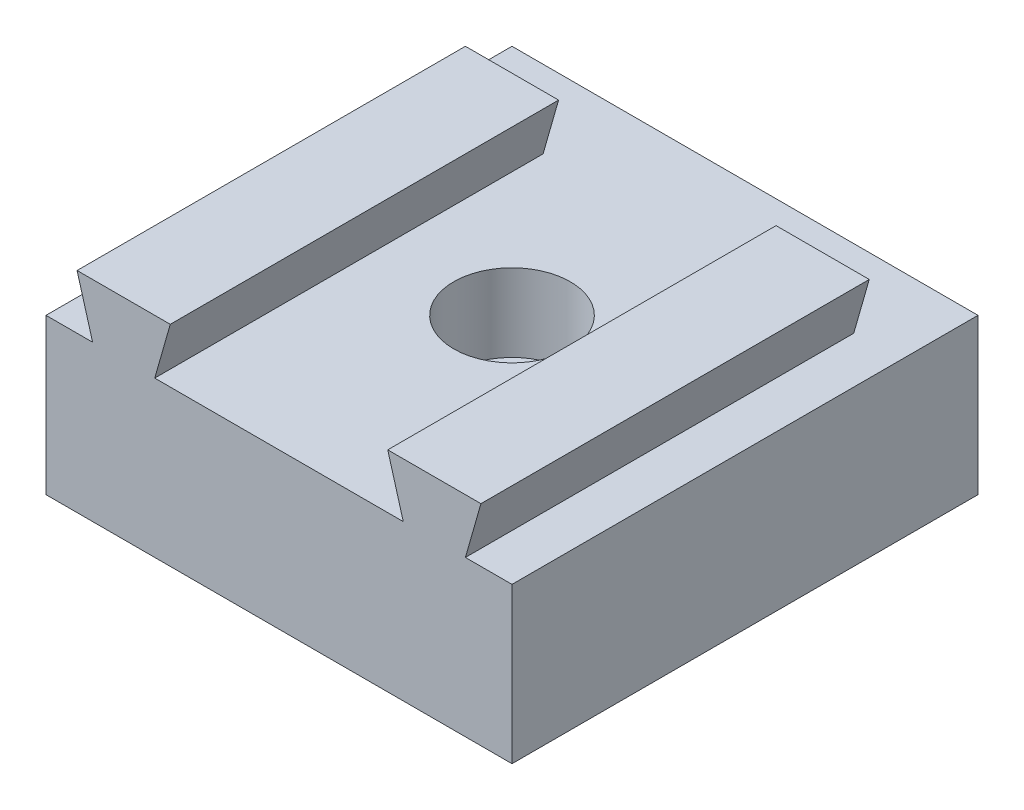
ISO-10303-21;
HEADER;
FILE_DESCRIPTION(('STEP AP214'),'2;1');
FILE_NAME('part.step','',(''),(''),'','','');
FILE_SCHEMA(('AUTOMOTIVE_DESIGN { 1 0 10303 214 1 1 1 1 }'));
ENDSEC;
DATA;
#1=APPLICATION_CONTEXT('core data for automotive mechanical design processes');
#2=APPLICATION_PROTOCOL_DEFINITION('international standard','automotive_design',2000,#1);
#3=PRODUCT_CONTEXT('',#1,'mechanical');
#4=PRODUCT('Part','Part','',(#3));
#5=PRODUCT_RELATED_PRODUCT_CATEGORY('part','',(#4));
#6=PRODUCT_DEFINITION_FORMATION('','',#4);
#7=PRODUCT_DEFINITION_CONTEXT('part definition',#1,'design');
#8=PRODUCT_DEFINITION('design','',#6,#7);
#9=PRODUCT_DEFINITION_SHAPE('','',#8);
#10=(LENGTH_UNIT() NAMED_UNIT(*) SI_UNIT(.MILLI.,.METRE.));
#11=(NAMED_UNIT(*) PLANE_ANGLE_UNIT() SI_UNIT($,.RADIAN.));
#12=(NAMED_UNIT(*) SI_UNIT($,.STERADIAN.) SOLID_ANGLE_UNIT());
#13=UNCERTAINTY_MEASURE_WITH_UNIT(LENGTH_MEASURE(1.E-05),#10,'distance_accuracy_value','');
#14=(GEOMETRIC_REPRESENTATION_CONTEXT(3) GLOBAL_UNCERTAINTY_ASSIGNED_CONTEXT((#13)) GLOBAL_UNIT_ASSIGNED_CONTEXT((#10,
#11,#12)) REPRESENTATION_CONTEXT('',''));
#15=CARTESIAN_POINT('',(0.,0.,0.));
#16=DIRECTION('',(0.,0.,1.));
#17=DIRECTION('',(1.,0.,0.));
#18=AXIS2_PLACEMENT_3D('',#15,#16,#17);
#19=CARTESIAN_POINT('',(0.,0.,0.));
#20=DIRECTION('',(0.,1.,0.));
#21=DIRECTION('',(0.,0.,1.));
#22=AXIS2_PLACEMENT_3D('',#19,#20,#21);
#23=CYLINDRICAL_SURFACE('',#22,4.);
#24=CARTESIAN_POINT('',(0.,10.,0.));
#25=DIRECTION('',(0.,1.,0.));
#26=DIRECTION('',(0.,0.,1.));
#27=AXIS2_PLACEMENT_3D('',#24,#25,#26);
#28=CIRCLE('',#27,4.);
#29=CARTESIAN_POINT('',(0.,10.,4.));
#30=VERTEX_POINT('',#29);
#31=EDGE_CURVE('E442',#30,#30,#28,.T.);
#32=ORIENTED_EDGE('',*,*,#31,.T.);
#33=EDGE_LOOP('',(#32));
#34=FACE_BOUND('',#33,.T.);
#35=CARTESIAN_POINT('',(0.,3.,0.));
#36=DIRECTION('',(0.,-1.,0.));
#37=DIRECTION('',(0.,0.,-1.));
#38=AXIS2_PLACEMENT_3D('',#35,#36,#37);
#39=CIRCLE('',#38,4.);
#40=CARTESIAN_POINT('',(0.,3.,-4.));
#41=VERTEX_POINT('',#40);
#42=EDGE_CURVE('E39',#41,#41,#39,.F.);
#43=ORIENTED_EDGE('',*,*,#42,.F.);
#44=EDGE_LOOP('',(#43));
#45=FACE_BOUND('',#44,.T.);
#46=ADVANCED_FACE('F35',(#34,#45),#23,.F.);
#47=CARTESIAN_POINT('',(0.,20.,0.));
#48=DIRECTION('',(0.,-1.,0.));
#49=DIRECTION('',(0.,0.,-1.));
#50=AXIS2_PLACEMENT_3D('',#47,#48,#49);
#51=PLANE('',#50);
#52=CARTESIAN_POINT('',(0.,20.,0.));
#53=DIRECTION('',(0.,1.,0.));
#54=DIRECTION('',(0.,0.,1.));
#55=AXIS2_PLACEMENT_3D('',#52,#53,#54);
#56=CIRCLE('',#55,7.5);
#57=CARTESIAN_POINT('',(0.,20.,7.5));
#58=VERTEX_POINT('',#57);
#59=EDGE_CURVE('E439',#58,#58,#56,.T.);
#60=ORIENTED_EDGE('',*,*,#59,.F.);
#61=EDGE_LOOP('',(#60));
#62=FACE_BOUND('',#61,.T.);
#63=DIRECTION('',(1.,0.,0.));
#64=VECTOR('',#63,1.);
#65=CARTESIAN_POINT('',(30.,20.,30.));
#66=LINE('',#65,#64);
#67=CARTESIAN_POINT('',(-16.,20.,30.));
#68=VERTEX_POINT('',#67);
#69=CARTESIAN_POINT('',(16.,20.,30.));
#70=VERTEX_POINT('',#69);
#71=EDGE_CURVE('E201',#68,#70,#66,.T.);
#72=ORIENTED_EDGE('',*,*,#71,.T.);
#73=DIRECTION('',(0.,0.,1.));
#74=VECTOR('',#73,1.);
#75=CARTESIAN_POINT('',(16.,20.,-20.));
#76=LINE('',#75,#74);
#77=CARTESIAN_POINT('',(16.,20.,-20.));
#78=VERTEX_POINT('',#77);
#79=EDGE_CURVE('E52',#78,#70,#76,.T.);
#80=ORIENTED_EDGE('',*,*,#79,.F.);
#81=DIRECTION('',(1.,0.,0.));
#82=VECTOR('',#81,1.);
#83=CARTESIAN_POINT('',(16.,20.,-20.));
#84=LINE('',#83,#82);
#85=CARTESIAN_POINT('',(24.,20.,-20.));
#86=VERTEX_POINT('',#85);
#87=EDGE_CURVE('E56',#78,#86,#84,.T.);
#88=ORIENTED_EDGE('',*,*,#87,.T.);
#89=DIRECTION('',(0.,0.,1.));
#90=VECTOR('',#89,1.);
#91=CARTESIAN_POINT('',(24.,20.,-20.));
#92=LINE('',#91,#90);
#93=CARTESIAN_POINT('',(24.,20.,30.));
#94=VERTEX_POINT('',#93);
#95=EDGE_CURVE('E144',#86,#94,#92,.T.);
#96=ORIENTED_EDGE('',*,*,#95,.T.);
#97=CARTESIAN_POINT('',(30.,20.,30.));
#98=VERTEX_POINT('',#97);
#99=EDGE_CURVE('E200',#94,#98,#66,.T.);
#100=ORIENTED_EDGE('',*,*,#99,.T.);
#101=DIRECTION('',(0.,0.,-1.));
#102=VECTOR('',#101,1.);
#103=CARTESIAN_POINT('',(30.,20.,30.));
#104=LINE('',#103,#102);
#105=CARTESIAN_POINT('',(30.,20.,-30.));
#106=VERTEX_POINT('',#105);
#107=EDGE_CURVE('E225',#98,#106,#104,.T.);
#108=ORIENTED_EDGE('',*,*,#107,.T.);
#109=DIRECTION('',(-1.,0.,0.));
#110=VECTOR('',#109,1.);
#111=CARTESIAN_POINT('',(30.,20.,-30.));
#112=LINE('',#111,#110);
#113=CARTESIAN_POINT('',(-30.,20.,-30.));
#114=VERTEX_POINT('',#113);
#115=EDGE_CURVE('E431',#106,#114,#112,.T.);
#116=ORIENTED_EDGE('',*,*,#115,.T.);
#117=DIRECTION('',(0.,0.,1.));
#118=VECTOR('',#117,1.);
#119=CARTESIAN_POINT('',(-30.,20.,30.));
#120=LINE('',#119,#118);
#121=CARTESIAN_POINT('',(-30.,20.,30.));
#122=VERTEX_POINT('',#121);
#123=EDGE_CURVE('E220',#114,#122,#120,.T.);
#124=ORIENTED_EDGE('',*,*,#123,.T.);
#125=CARTESIAN_POINT('',(-24.,20.,30.));
#126=VERTEX_POINT('',#125);
#127=EDGE_CURVE('E204',#122,#126,#66,.T.);
#128=ORIENTED_EDGE('',*,*,#127,.T.);
#129=DIRECTION('',(0.,0.,1.));
#130=VECTOR('',#129,1.);
#131=CARTESIAN_POINT('',(-24.,20.,-20.));
#132=LINE('',#131,#130);
#133=CARTESIAN_POINT('',(-24.,20.,-20.));
#134=VERTEX_POINT('',#133);
#135=EDGE_CURVE('E174',#134,#126,#132,.T.);
#136=ORIENTED_EDGE('',*,*,#135,.F.);
#137=DIRECTION('',(1.,0.,0.));
#138=VECTOR('',#137,1.);
#139=CARTESIAN_POINT('',(-24.,20.,-20.));
#140=LINE('',#139,#138);
#141=CARTESIAN_POINT('',(-16.,20.,-20.));
#142=VERTEX_POINT('',#141);
#143=EDGE_CURVE('E165',#134,#142,#140,.T.);
#144=ORIENTED_EDGE('',*,*,#143,.T.);
#145=DIRECTION('',(0.,0.,1.));
#146=VECTOR('',#145,1.);
#147=CARTESIAN_POINT('',(-16.,20.,-20.));
#148=LINE('',#147,#146);
#149=EDGE_CURVE('E183',#142,#68,#148,.T.);
#150=ORIENTED_EDGE('',*,*,#149,.T.);
#151=EDGE_LOOP('',(#72,#80,#88,#96,#100,#108,#116,#124,#128,#136,#144,#150));
#152=FACE_BOUND('',#151,.T.);
#153=ADVANCED_FACE('F236',(#62,#152),#51,.F.);
#154=CARTESIAN_POINT('',(30.,20.,30.));
#155=DIRECTION('',(0.,0.,-1.));
#156=DIRECTION('',(-1.,0.,0.));
#157=AXIS2_PLACEMENT_3D('',#154,#155,#156);
#158=PLANE('',#157);
#159=DIRECTION('',(1.,0.,0.));
#160=VECTOR('',#159,1.);
#161=CARTESIAN_POINT('',(30.,0.,30.));
#162=LINE('',#161,#160);
#163=CARTESIAN_POINT('',(-30.,0.,30.));
#164=VERTEX_POINT('',#163);
#165=CARTESIAN_POINT('',(30.,0.,30.));
#166=VERTEX_POINT('',#165);
#167=EDGE_CURVE('E180',#164,#166,#162,.T.);
#168=ORIENTED_EDGE('',*,*,#167,.T.);
#169=DIRECTION('',(0.,-1.,0.));
#170=VECTOR('',#169,1.);
#171=CARTESIAN_POINT('',(30.,20.,30.));
#172=LINE('',#171,#170);
#173=EDGE_CURVE('E11',#98,#166,#172,.T.);
#174=ORIENTED_EDGE('',*,*,#173,.F.);
#175=ORIENTED_EDGE('',*,*,#99,.F.);
#176=DIRECTION('',(0.274721127897378,0.961523947640823,0.));
#177=VECTOR('',#176,1.);
#178=CARTESIAN_POINT('',(24.,20.,30.));
#179=LINE('',#178,#177);
#180=CARTESIAN_POINT('',(26.,27.,30.));
#181=VERTEX_POINT('',#180);
#182=EDGE_CURVE('E154',#94,#181,#179,.T.);
#183=ORIENTED_EDGE('',*,*,#182,.T.);
#184=DIRECTION('',(1.,0.,0.));
#185=VECTOR('',#184,1.);
#186=CARTESIAN_POINT('',(14.,27.,30.));
#187=LINE('',#186,#185);
#188=CARTESIAN_POINT('',(14.,27.,30.));
#189=VERTEX_POINT('',#188);
#190=EDGE_CURVE('E139',#189,#181,#187,.T.);
#191=ORIENTED_EDGE('',*,*,#190,.F.);
#192=DIRECTION('',(0.274721127897378,-0.961523947640823,0.));
#193=VECTOR('',#192,1.);
#194=CARTESIAN_POINT('',(14.,27.,30.));
#195=LINE('',#194,#193);
#196=EDGE_CURVE('E151',#189,#70,#195,.T.);
#197=ORIENTED_EDGE('',*,*,#196,.T.);
#198=ORIENTED_EDGE('',*,*,#71,.F.);
#199=DIRECTION('',(0.274721127897378,0.961523947640823,0.));
#200=VECTOR('',#199,1.);
#201=CARTESIAN_POINT('',(-16.,20.,30.));
#202=LINE('',#201,#200);
#203=CARTESIAN_POINT('',(-14.,27.,30.));
#204=VERTEX_POINT('',#203);
#205=EDGE_CURVE('E177',#68,#204,#202,.T.);
#206=ORIENTED_EDGE('',*,*,#205,.T.);
#207=DIRECTION('',(1.,0.,0.));
#208=VECTOR('',#207,1.);
#209=CARTESIAN_POINT('',(-26.,27.,30.));
#210=LINE('',#209,#208);
#211=CARTESIAN_POINT('',(-26.,27.,30.));
#212=VERTEX_POINT('',#211);
#213=EDGE_CURVE('E166',#212,#204,#210,.T.);
#214=ORIENTED_EDGE('',*,*,#213,.F.);
#215=DIRECTION('',(0.274721127897378,-0.961523947640823,0.));
#216=VECTOR('',#215,1.);
#217=CARTESIAN_POINT('',(-26.,27.,30.));
#218=LINE('',#217,#216);
#219=EDGE_CURVE('E158',#212,#126,#218,.T.);
#220=ORIENTED_EDGE('',*,*,#219,.T.);
#221=ORIENTED_EDGE('',*,*,#127,.F.);
#222=DIRECTION('',(0.,-1.,0.));
#223=VECTOR('',#222,1.);
#224=CARTESIAN_POINT('',(-30.,20.,30.));
#225=LINE('',#224,#223);
#226=EDGE_CURVE('E217',#122,#164,#225,.T.);
#227=ORIENTED_EDGE('',*,*,#226,.T.);
#228=EDGE_LOOP('',(#168,#174,#175,#183,#191,#197,#198,#206,#214,#220,#221,#227));
#229=FACE_BOUND('',#228,.T.);
#230=ADVANCED_FACE('F37',(#229),#158,.F.);
#231=CARTESIAN_POINT('',(30.,20.,30.));
#232=DIRECTION('',(-1.,0.,0.));
#233=DIRECTION('',(0.,0.,1.));
#234=AXIS2_PLACEMENT_3D('',#231,#232,#233);
#235=PLANE('',#234);
#236=DIRECTION('',(0.,0.,-1.));
#237=VECTOR('',#236,1.);
#238=CARTESIAN_POINT('',(30.,0.,30.));
#239=LINE('',#238,#237);
#240=CARTESIAN_POINT('',(30.,0.,-30.));
#241=VERTEX_POINT('',#240);
#242=EDGE_CURVE('E213',#166,#241,#239,.T.);
#243=ORIENTED_EDGE('',*,*,#242,.T.);
#244=DIRECTION('',(0.,-1.,0.));
#245=VECTOR('',#244,1.);
#246=CARTESIAN_POINT('',(30.,20.,-30.));
#247=LINE('',#246,#245);
#248=EDGE_CURVE('E44',#106,#241,#247,.T.);
#249=ORIENTED_EDGE('',*,*,#248,.F.);
#250=ORIENTED_EDGE('',*,*,#107,.F.);
#251=ORIENTED_EDGE('',*,*,#173,.T.);
#252=EDGE_LOOP('',(#243,#249,#250,#251));
#253=FACE_BOUND('',#252,.T.);
#254=ADVANCED_FACE('F359',(#253),#235,.F.);
#255=CARTESIAN_POINT('',(30.,20.,-30.));
#256=DIRECTION('',(0.,0.,1.));
#257=DIRECTION('',(1.,0.,0.));
#258=AXIS2_PLACEMENT_3D('',#255,#256,#257);
#259=PLANE('',#258);
#260=DIRECTION('',(-1.,0.,0.));
#261=VECTOR('',#260,1.);
#262=CARTESIAN_POINT('',(30.,0.,-30.));
#263=LINE('',#262,#261);
#264=CARTESIAN_POINT('',(-30.,0.,-30.));
#265=VERTEX_POINT('',#264);
#266=EDGE_CURVE('E206',#241,#265,#263,.T.);
#267=ORIENTED_EDGE('',*,*,#266,.T.);
#268=DIRECTION('',(0.,-1.,0.));
#269=VECTOR('',#268,1.);
#270=CARTESIAN_POINT('',(-30.,20.,-30.));
#271=LINE('',#270,#269);
#272=EDGE_CURVE('E219',#114,#265,#271,.T.);
#273=ORIENTED_EDGE('',*,*,#272,.F.);
#274=ORIENTED_EDGE('',*,*,#115,.F.);
#275=ORIENTED_EDGE('',*,*,#248,.T.);
#276=EDGE_LOOP('',(#267,#273,#274,#275));
#277=FACE_BOUND('',#276,.T.);
#278=ADVANCED_FACE('F388',(#277),#259,.F.);
#279=CARTESIAN_POINT('',(-30.,20.,30.));
#280=DIRECTION('',(1.,0.,0.));
#281=DIRECTION('',(0.,0.,-1.));
#282=AXIS2_PLACEMENT_3D('',#279,#280,#281);
#283=PLANE('',#282);
#284=DIRECTION('',(0.,0.,1.));
#285=VECTOR('',#284,1.);
#286=CARTESIAN_POINT('',(-30.,0.,30.));
#287=LINE('',#286,#285);
#288=EDGE_CURVE('E202',#265,#164,#287,.T.);
#289=ORIENTED_EDGE('',*,*,#288,.T.);
#290=ORIENTED_EDGE('',*,*,#226,.F.);
#291=ORIENTED_EDGE('',*,*,#123,.F.);
#292=ORIENTED_EDGE('',*,*,#272,.T.);
#293=EDGE_LOOP('',(#289,#290,#291,#292));
#294=FACE_BOUND('',#293,.T.);
#295=ADVANCED_FACE('F383',(#294),#283,.F.);
#296=CARTESIAN_POINT('',(0.,0.,0.));
#297=DIRECTION('',(0.,-1.,0.));
#298=DIRECTION('',(0.,0.,-1.));
#299=AXIS2_PLACEMENT_3D('',#296,#297,#298);
#300=PLANE('',#299);
#301=CARTESIAN_POINT('',(0.,0.,0.));
#302=DIRECTION('',(0.,-1.,0.));
#303=DIRECTION('',(0.,0.,-1.));
#304=AXIS2_PLACEMENT_3D('',#301,#302,#303);
#305=CIRCLE('',#304,12.5);
#306=CARTESIAN_POINT('',(0.,0.,-12.5));
#307=VERTEX_POINT('',#306);
#308=EDGE_CURVE('E424',#307,#307,#305,.T.);
#309=ORIENTED_EDGE('',*,*,#308,.F.);
#310=EDGE_LOOP('',(#309));
#311=FACE_BOUND('',#310,.T.);
#312=ORIENTED_EDGE('',*,*,#167,.F.);
#313=ORIENTED_EDGE('',*,*,#288,.F.);
#314=ORIENTED_EDGE('',*,*,#266,.F.);
#315=ORIENTED_EDGE('',*,*,#242,.F.);
#316=EDGE_LOOP('',(#312,#313,#314,#315));
#317=FACE_BOUND('',#316,.T.);
#318=ADVANCED_FACE('F253',(#311,#317),#300,.T.);
#319=CARTESIAN_POINT('',(-26.,27.,-20.));
#320=DIRECTION('',(-0.961523947640823,-0.274721127897378,0.));
#321=DIRECTION('',(0.274721127897378,-0.961523947640823,0.));
#322=AXIS2_PLACEMENT_3D('',#319,#320,#321);
#323=PLANE('',#322);
#324=ORIENTED_EDGE('',*,*,#219,.F.);
#325=DIRECTION('',(0.,0.,1.));
#326=VECTOR('',#325,1.);
#327=CARTESIAN_POINT('',(-26.,27.,-20.));
#328=LINE('',#327,#326);
#329=CARTESIAN_POINT('',(-26.,27.,-20.));
#330=VERTEX_POINT('',#329);
#331=EDGE_CURVE('E178',#330,#212,#328,.T.);
#332=ORIENTED_EDGE('',*,*,#331,.F.);
#333=DIRECTION('',(0.274721127897378,-0.961523947640823,0.));
#334=VECTOR('',#333,1.);
#335=CARTESIAN_POINT('',(-26.,27.,-20.));
#336=LINE('',#335,#334);
#337=EDGE_CURVE('E162',#330,#134,#336,.T.);
#338=ORIENTED_EDGE('',*,*,#337,.T.);
#339=ORIENTED_EDGE('',*,*,#135,.T.);
#340=EDGE_LOOP('',(#324,#332,#338,#339));
#341=FACE_BOUND('',#340,.T.);
#342=ADVANCED_FACE('F242',(#341),#323,.T.);
#343=CARTESIAN_POINT('',(-26.,27.,-20.));
#344=DIRECTION('',(0.,-1.,0.));
#345=DIRECTION('',(0.,0.,-1.));
#346=AXIS2_PLACEMENT_3D('',#343,#344,#345);
#347=PLANE('',#346);
#348=ORIENTED_EDGE('',*,*,#213,.T.);
#349=DIRECTION('',(0.,0.,1.));
#350=VECTOR('',#349,1.);
#351=CARTESIAN_POINT('',(-14.,27.,-20.));
#352=LINE('',#351,#350);
#353=CARTESIAN_POINT('',(-14.,27.,-20.));
#354=VERTEX_POINT('',#353);
#355=EDGE_CURVE('E181',#354,#204,#352,.T.);
#356=ORIENTED_EDGE('',*,*,#355,.F.);
#357=DIRECTION('',(1.,0.,0.));
#358=VECTOR('',#357,1.);
#359=CARTESIAN_POINT('',(-26.,27.,-20.));
#360=LINE('',#359,#358);
#361=EDGE_CURVE('E172',#330,#354,#360,.T.);
#362=ORIENTED_EDGE('',*,*,#361,.F.);
#363=ORIENTED_EDGE('',*,*,#331,.T.);
#364=EDGE_LOOP('',(#348,#356,#362,#363));
#365=FACE_BOUND('',#364,.T.);
#366=ADVANCED_FACE('F245',(#365),#347,.F.);
#367=CARTESIAN_POINT('',(-16.,20.,-20.));
#368=DIRECTION('',(0.961523947640823,-0.274721127897378,0.));
#369=DIRECTION('',(0.274721127897378,0.961523947640823,0.));
#370=AXIS2_PLACEMENT_3D('',#367,#368,#369);
#371=PLANE('',#370);
#372=ORIENTED_EDGE('',*,*,#205,.F.);
#373=ORIENTED_EDGE('',*,*,#149,.F.);
#374=DIRECTION('',(0.274721127897378,0.961523947640823,0.));
#375=VECTOR('',#374,1.);
#376=CARTESIAN_POINT('',(-16.,20.,-20.));
#377=LINE('',#376,#375);
#378=EDGE_CURVE('E169',#142,#354,#377,.T.);
#379=ORIENTED_EDGE('',*,*,#378,.T.);
#380=ORIENTED_EDGE('',*,*,#355,.T.);
#381=EDGE_LOOP('',(#372,#373,#379,#380));
#382=FACE_BOUND('',#381,.T.);
#383=ADVANCED_FACE('F233',(#382),#371,.T.);
#384=CARTESIAN_POINT('',(0.,0.,-20.));
#385=DIRECTION('',(0.,0.,1.));
#386=DIRECTION('',(1.,0.,0.));
#387=AXIS2_PLACEMENT_3D('',#384,#385,#386);
#388=PLANE('',#387);
#389=ORIENTED_EDGE('',*,*,#337,.F.);
#390=ORIENTED_EDGE('',*,*,#361,.T.);
#391=ORIENTED_EDGE('',*,*,#378,.F.);
#392=ORIENTED_EDGE('',*,*,#143,.F.);
#393=EDGE_LOOP('',(#389,#390,#391,#392));
#394=FACE_BOUND('',#393,.T.);
#395=ADVANCED_FACE('F240',(#394),#388,.F.);
#396=CARTESIAN_POINT('',(14.,27.,-20.));
#397=DIRECTION('',(-0.961523947640823,-0.274721127897378,0.));
#398=DIRECTION('',(0.274721127897378,-0.961523947640823,0.));
#399=AXIS2_PLACEMENT_3D('',#396,#397,#398);
#400=PLANE('',#399);
#401=ORIENTED_EDGE('',*,*,#196,.F.);
#402=DIRECTION('',(0.,0.,1.));
#403=VECTOR('',#402,1.);
#404=CARTESIAN_POINT('',(14.,27.,-20.));
#405=LINE('',#404,#403);
#406=CARTESIAN_POINT('',(14.,27.,-20.));
#407=VERTEX_POINT('',#406);
#408=EDGE_CURVE('E143',#407,#189,#405,.T.);
#409=ORIENTED_EDGE('',*,*,#408,.F.);
#410=DIRECTION('',(0.274721127897378,-0.961523947640823,0.));
#411=VECTOR('',#410,1.);
#412=CARTESIAN_POINT('',(14.,27.,-20.));
#413=LINE('',#412,#411);
#414=EDGE_CURVE('E132',#407,#78,#413,.T.);
#415=ORIENTED_EDGE('',*,*,#414,.T.);
#416=ORIENTED_EDGE('',*,*,#79,.T.);
#417=EDGE_LOOP('',(#401,#409,#415,#416));
#418=FACE_BOUND('',#417,.T.);
#419=ADVANCED_FACE('F283',(#418),#400,.T.);
#420=CARTESIAN_POINT('',(14.,27.,-20.));
#421=DIRECTION('',(0.,-1.,0.));
#422=DIRECTION('',(0.,0.,-1.));
#423=AXIS2_PLACEMENT_3D('',#420,#421,#422);
#424=PLANE('',#423);
#425=ORIENTED_EDGE('',*,*,#190,.T.);
#426=DIRECTION('',(0.,0.,1.));
#427=VECTOR('',#426,1.);
#428=CARTESIAN_POINT('',(26.,27.,-20.));
#429=LINE('',#428,#427);
#430=CARTESIAN_POINT('',(26.,27.,-20.));
#431=VERTEX_POINT('',#430);
#432=EDGE_CURVE('E136',#431,#181,#429,.T.);
#433=ORIENTED_EDGE('',*,*,#432,.F.);
#434=DIRECTION('',(1.,0.,0.));
#435=VECTOR('',#434,1.);
#436=CARTESIAN_POINT('',(14.,27.,-20.));
#437=LINE('',#436,#435);
#438=EDGE_CURVE('E126',#407,#431,#437,.T.);
#439=ORIENTED_EDGE('',*,*,#438,.F.);
#440=ORIENTED_EDGE('',*,*,#408,.T.);
#441=EDGE_LOOP('',(#425,#433,#439,#440));
#442=FACE_BOUND('',#441,.T.);
#443=ADVANCED_FACE('F137',(#442),#424,.F.);
#444=CARTESIAN_POINT('',(24.,20.,-20.));
#445=DIRECTION('',(0.961523947640823,-0.274721127897378,0.));
#446=DIRECTION('',(0.274721127897378,0.961523947640823,0.));
#447=AXIS2_PLACEMENT_3D('',#444,#445,#446);
#448=PLANE('',#447);
#449=ORIENTED_EDGE('',*,*,#182,.F.);
#450=ORIENTED_EDGE('',*,*,#95,.F.);
#451=DIRECTION('',(0.274721127897378,0.961523947640823,0.));
#452=VECTOR('',#451,1.);
#453=CARTESIAN_POINT('',(24.,20.,-20.));
#454=LINE('',#453,#452);
#455=EDGE_CURVE('E130',#86,#431,#454,.T.);
#456=ORIENTED_EDGE('',*,*,#455,.T.);
#457=ORIENTED_EDGE('',*,*,#432,.T.);
#458=EDGE_LOOP('',(#449,#450,#456,#457));
#459=FACE_BOUND('',#458,.T.);
#460=ADVANCED_FACE('F146',(#459),#448,.T.);
#461=CARTESIAN_POINT('',(40.,0.,-20.));
#462=DIRECTION('',(0.,0.,1.));
#463=DIRECTION('',(1.,0.,0.));
#464=AXIS2_PLACEMENT_3D('',#461,#462,#463);
#465=PLANE('',#464);
#466=ORIENTED_EDGE('',*,*,#414,.F.);
#467=ORIENTED_EDGE('',*,*,#438,.T.);
#468=ORIENTED_EDGE('',*,*,#455,.F.);
#469=ORIENTED_EDGE('',*,*,#87,.F.);
#470=EDGE_LOOP('',(#466,#467,#468,#469));
#471=FACE_BOUND('',#470,.T.);
#472=ADVANCED_FACE('F128',(#471),#465,.F.);
#473=CARTESIAN_POINT('',(0.,10.,0.));
#474=DIRECTION('',(0.,1.,0.));
#475=DIRECTION('',(0.,0.,1.));
#476=AXIS2_PLACEMENT_3D('',#473,#474,#475);
#477=CYLINDRICAL_SURFACE('',#476,7.5);
#478=CARTESIAN_POINT('',(0.,10.,0.));
#479=DIRECTION('',(0.,1.,0.));
#480=DIRECTION('',(0.,0.,1.));
#481=AXIS2_PLACEMENT_3D('',#478,#479,#480);
#482=CIRCLE('',#481,7.5);
#483=CARTESIAN_POINT('',(0.,10.,7.5));
#484=VERTEX_POINT('',#483);
#485=EDGE_CURVE('E155',#484,#484,#482,.T.);
#486=ORIENTED_EDGE('',*,*,#485,.F.);
#487=EDGE_LOOP('',(#486));
#488=FACE_BOUND('',#487,.T.);
#489=ORIENTED_EDGE('',*,*,#59,.T.);
#490=EDGE_LOOP('',(#489));
#491=FACE_BOUND('',#490,.T.);
#492=ADVANCED_FACE('F274',(#488,#491),#477,.F.);
#493=CARTESIAN_POINT('',(0.,10.,0.));
#494=DIRECTION('',(0.,1.,0.));
#495=DIRECTION('',(0.,0.,1.));
#496=AXIS2_PLACEMENT_3D('',#493,#494,#495);
#497=PLANE('',#496);
#498=ORIENTED_EDGE('',*,*,#31,.F.);
#499=EDGE_LOOP('',(#498));
#500=FACE_BOUND('',#499,.T.);
#501=ORIENTED_EDGE('',*,*,#485,.T.);
#502=EDGE_LOOP('',(#501));
#503=FACE_BOUND('',#502,.T.);
#504=ADVANCED_FACE('F270',(#500,#503),#497,.T.);
#505=CARTESIAN_POINT('',(0.,3.,0.));
#506=DIRECTION('',(0.,-1.,0.));
#507=DIRECTION('',(0.,0.,-1.));
#508=AXIS2_PLACEMENT_3D('',#505,#506,#507);
#509=PLANE('',#508);
#510=CARTESIAN_POINT('',(0.,3.,0.));
#511=DIRECTION('',(0.,-1.,0.));
#512=DIRECTION('',(0.,0.,-1.));
#513=AXIS2_PLACEMENT_3D('',#510,#511,#512);
#514=CIRCLE('',#513,12.5);
#515=CARTESIAN_POINT('',(0.,3.,-12.5));
#516=VERTEX_POINT('',#515);
#517=EDGE_CURVE('E447',#516,#516,#514,.T.);
#518=ORIENTED_EDGE('',*,*,#517,.T.);
#519=EDGE_LOOP('',(#518));
#520=FACE_BOUND('',#519,.T.);
#521=ORIENTED_EDGE('',*,*,#42,.T.);
#522=EDGE_LOOP('',(#521));
#523=FACE_BOUND('',#522,.T.);
#524=ADVANCED_FACE('F273',(#520,#523),#509,.T.);
#525=CARTESIAN_POINT('',(0.,3.,0.));
#526=DIRECTION('',(0.,-1.,0.));
#527=DIRECTION('',(0.,0.,-1.));
#528=AXIS2_PLACEMENT_3D('',#525,#526,#527);
#529=CYLINDRICAL_SURFACE('',#528,12.5);
#530=ORIENTED_EDGE('',*,*,#517,.F.);
#531=EDGE_LOOP('',(#530));
#532=FACE_BOUND('',#531,.T.);
#533=ORIENTED_EDGE('',*,*,#308,.T.);
#534=EDGE_LOOP('',(#533));
#535=FACE_BOUND('',#534,.T.);
#536=ADVANCED_FACE('F268',(#532,#535),#529,.F.);
#537=CLOSED_SHELL('',(#46,#153,#230,#254,#278,#295,#318,#342,#366,#383,#395,#419,#443,#460,#472,
#492,#504,#524,#536));
#538=MANIFOLD_SOLID_BREP('B2',#537);
#539=ADVANCED_BREP_SHAPE_REPRESENTATION('',(#18,#538),#14);
#540=SHAPE_DEFINITION_REPRESENTATION(#9,#539);
ENDSEC;
END-ISO-10303-21;
